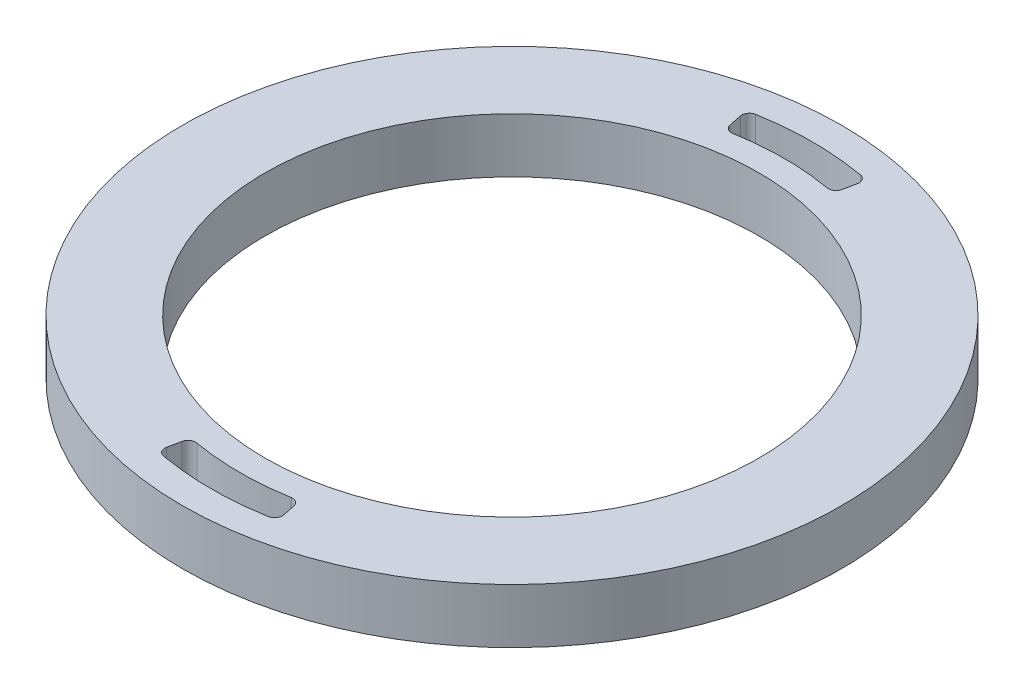
ISO-10303-21;
HEADER;
FILE_DESCRIPTION(('STEP AP214'),'2;1');
FILE_NAME('part.step','',(''),(''),'','','');
FILE_SCHEMA(('AUTOMOTIVE_DESIGN { 1 0 10303 214 1 1 1 1 }'));
ENDSEC;
DATA;
#1=APPLICATION_CONTEXT('core data for automotive mechanical design processes');
#2=APPLICATION_PROTOCOL_DEFINITION('international standard','automotive_design',2000,#1);
#3=PRODUCT_CONTEXT('',#1,'mechanical');
#4=PRODUCT('Part','Part','',(#3));
#5=PRODUCT_RELATED_PRODUCT_CATEGORY('part','',(#4));
#6=PRODUCT_DEFINITION_FORMATION('','',#4);
#7=PRODUCT_DEFINITION_CONTEXT('part definition',#1,'design');
#8=PRODUCT_DEFINITION('design','',#6,#7);
#9=PRODUCT_DEFINITION_SHAPE('','',#8);
#10=(LENGTH_UNIT() NAMED_UNIT(*) SI_UNIT(.MILLI.,.METRE.));
#11=(NAMED_UNIT(*) PLANE_ANGLE_UNIT() SI_UNIT($,.RADIAN.));
#12=(NAMED_UNIT(*) SI_UNIT($,.STERADIAN.) SOLID_ANGLE_UNIT());
#13=UNCERTAINTY_MEASURE_WITH_UNIT(LENGTH_MEASURE(1.E-05),#10,'distance_accuracy_value','');
#14=(GEOMETRIC_REPRESENTATION_CONTEXT(3) GLOBAL_UNCERTAINTY_ASSIGNED_CONTEXT((#13)) GLOBAL_UNIT_ASSIGNED_CONTEXT((#10,
#11,#12)) REPRESENTATION_CONTEXT('',''));
#15=CARTESIAN_POINT('',(0.,0.,0.));
#16=DIRECTION('',(0.,0.,1.));
#17=DIRECTION('',(1.,0.,0.));
#18=AXIS2_PLACEMENT_3D('',#15,#16,#17);
#19=CARTESIAN_POINT('',(0.,6.35,0.));
#20=DIRECTION('',(0.,1.,0.));
#21=DIRECTION('',(0.,0.,1.));
#22=AXIS2_PLACEMENT_3D('',#19,#20,#21);
#23=PLANE('',#22);
#24=DIRECTION('',(-0.2,0.,0.979795897113271));
#25=VECTOR('',#24,1.);
#26=CARTESIAN_POINT('',(0.,6.35,0.));
#27=LINE('',#26,#25);
#28=CARTESIAN_POINT('',(-6.49996868607842,6.35,31.8432132499219));
#29=VERTEX_POINT('',#28);
#30=CARTESIAN_POINT('',(-6.80487758890636,6.35,33.3369557098425));
#31=VERTEX_POINT('',#30);
#32=EDGE_CURVE('E163',#29,#31,#27,.T.);
#33=ORIENTED_EDGE('',*,*,#32,.F.);
#34=CARTESIAN_POINT('',(-5.62893013354472,6.35,32.0210132499219));
#35=DIRECTION('',(0.,1.,0.));
#36=DIRECTION('',(0.,0.,1.));
#37=AXIS2_PLACEMENT_3D('',#34,#35,#36);
#38=CIRCLE('',#37,0.889);
#39=CARTESIAN_POINT('',(-5.47501407520561,6.35,31.1454386688693));
#40=VERTEX_POINT('',#39);
#41=EDGE_CURVE('E158',#29,#40,#38,.F.);
#42=ORIENTED_EDGE('',*,*,#41,.T.);
#43=CARTESIAN_POINT('',(0.,6.35,0.));
#44=DIRECTION('',(0.,1.,0.));
#45=DIRECTION('',(0.,0.,1.));
#46=AXIS2_PLACEMENT_3D('',#43,#44,#45);
#47=CIRCLE('',#46,31.623);
#48=CARTESIAN_POINT('',(5.47501407520561,6.35,31.1454386688693));
#49=VERTEX_POINT('',#48);
#50=EDGE_CURVE('E161',#40,#49,#47,.T.);
#51=ORIENTED_EDGE('',*,*,#50,.T.);
#52=CARTESIAN_POINT('',(5.62893013354472,6.35,32.0210132499219));
#53=DIRECTION('',(0.,1.,0.));
#54=DIRECTION('',(0.,0.,1.));
#55=AXIS2_PLACEMENT_3D('',#52,#53,#54);
#56=CIRCLE('',#55,0.889);
#57=CARTESIAN_POINT('',(6.49996868607842,6.35,31.8432132499219));
#58=VERTEX_POINT('',#57);
#59=EDGE_CURVE('E244',#49,#58,#56,.F.);
#60=ORIENTED_EDGE('',*,*,#59,.T.);
#61=DIRECTION('',(0.2,0.,0.979795897113271));
#62=VECTOR('',#61,1.);
#63=CARTESIAN_POINT('',(0.,6.35,0.));
#64=LINE('',#63,#62);
#65=CARTESIAN_POINT('',(6.80487758890636,6.35,33.3369557098425));
#66=VERTEX_POINT('',#65);
#67=EDGE_CURVE('E182',#58,#66,#64,.T.);
#68=ORIENTED_EDGE('',*,*,#67,.T.);
#69=CARTESIAN_POINT('',(5.93383903637266,6.35,33.5147557098425));
#70=DIRECTION('',(0.,1.,0.));
#71=DIRECTION('',(0.,0.,1.));
#72=AXIS2_PLACEMENT_3D('',#69,#70,#71);
#73=CIRCLE('',#72,0.889);
#74=CARTESIAN_POINT('',(6.08882736941224,6.35,34.3901411201742));
#75=VERTEX_POINT('',#74);
#76=EDGE_CURVE('E257',#66,#75,#73,.F.);
#77=ORIENTED_EDGE('',*,*,#76,.T.);
#78=CARTESIAN_POINT('',(0.,6.35,0.));
#79=DIRECTION('',(0.,1.,0.));
#80=DIRECTION('',(0.,0.,1.));
#81=AXIS2_PLACEMENT_3D('',#78,#79,#80);
#82=CIRCLE('',#81,34.925);
#83=CARTESIAN_POINT('',(-6.08882736941224,6.35,34.3901411201742));
#84=VERTEX_POINT('',#83);
#85=EDGE_CURVE('E342',#84,#75,#82,.T.);
#86=ORIENTED_EDGE('',*,*,#85,.F.);
#87=CARTESIAN_POINT('',(-5.93383903637266,6.35,33.5147557098425));
#88=DIRECTION('',(0.,1.,0.));
#89=DIRECTION('',(0.,0.,1.));
#90=AXIS2_PLACEMENT_3D('',#87,#88,#89);
#91=CIRCLE('',#90,0.889);
#92=EDGE_CURVE('E251',#84,#31,#91,.F.);
#93=ORIENTED_EDGE('',*,*,#92,.T.);
#94=EDGE_LOOP('',(#33,#42,#51,#60,#68,#77,#86,#93));
#95=FACE_BOUND('',#94,.T.);
#96=CARTESIAN_POINT('',(0.,6.35,0.));
#97=DIRECTION('',(0.,1.,0.));
#98=DIRECTION('',(0.,0.,1.));
#99=AXIS2_PLACEMENT_3D('',#96,#97,#98);
#100=CIRCLE('',#99,38.2905);
#101=CARTESIAN_POINT('',(0.,6.35,38.2905));
#102=VERTEX_POINT('',#101);
#103=EDGE_CURVE('E187',#102,#102,#100,.T.);
#104=ORIENTED_EDGE('',*,*,#103,.T.);
#105=EDGE_LOOP('',(#104));
#106=FACE_BOUND('',#105,.T.);
#107=CARTESIAN_POINT('',(0.,6.35,0.));
#108=DIRECTION('',(0.,1.,0.));
#109=DIRECTION('',(0.,0.,1.));
#110=AXIS2_PLACEMENT_3D('',#107,#108,#109);
#111=CIRCLE('',#110,28.702);
#112=CARTESIAN_POINT('',(0.,6.35,28.702));
#113=VERTEX_POINT('',#112);
#114=EDGE_CURVE('E349',#113,#113,#111,.T.);
#115=ORIENTED_EDGE('',*,*,#114,.F.);
#116=EDGE_LOOP('',(#115));
#117=FACE_BOUND('',#116,.T.);
#118=DIRECTION('',(0.2,0.,-0.979795897113271));
#119=VECTOR('',#118,1.);
#120=CARTESIAN_POINT('',(0.,6.35,0.));
#121=LINE('',#120,#119);
#122=CARTESIAN_POINT('',(6.49996868607842,6.35,-31.8432132499219));
#123=VERTEX_POINT('',#122);
#124=CARTESIAN_POINT('',(6.80487758890636,6.35,-33.3369557098425));
#125=VERTEX_POINT('',#124);
#126=EDGE_CURVE('E319',#123,#125,#121,.T.);
#127=ORIENTED_EDGE('',*,*,#126,.F.);
#128=CARTESIAN_POINT('',(5.62893013354472,6.35,-32.0210132499219));
#129=DIRECTION('',(0.,1.,0.));
#130=DIRECTION('',(0.,0.,1.));
#131=AXIS2_PLACEMENT_3D('',#128,#129,#130);
#132=CIRCLE('',#131,0.889);
#133=CARTESIAN_POINT('',(5.47501407520561,6.35,-31.1454386688693));
#134=VERTEX_POINT('',#133);
#135=EDGE_CURVE('E263',#123,#134,#132,.F.);
#136=ORIENTED_EDGE('',*,*,#135,.T.);
#137=CARTESIAN_POINT('',(0.,6.35,0.));
#138=DIRECTION('',(0.,1.,0.));
#139=DIRECTION('',(0.,0.,1.));
#140=AXIS2_PLACEMENT_3D('',#137,#138,#139);
#141=CIRCLE('',#140,31.623);
#142=CARTESIAN_POINT('',(-5.47501407520561,6.35,-31.1454386688693));
#143=VERTEX_POINT('',#142);
#144=EDGE_CURVE('E286',#134,#143,#141,.T.);
#145=ORIENTED_EDGE('',*,*,#144,.T.);
#146=CARTESIAN_POINT('',(-5.62893013354472,6.35,-32.0210132499219));
#147=DIRECTION('',(0.,1.,0.));
#148=DIRECTION('',(0.,0.,1.));
#149=AXIS2_PLACEMENT_3D('',#146,#147,#148);
#150=CIRCLE('',#149,0.889);
#151=CARTESIAN_POINT('',(-6.49996868607842,6.35,-31.8432132499219));
#152=VERTEX_POINT('',#151);
#153=EDGE_CURVE('E52',#143,#152,#150,.F.);
#154=ORIENTED_EDGE('',*,*,#153,.T.);
#155=DIRECTION('',(-0.2,0.,-0.979795897113271));
#156=VECTOR('',#155,1.);
#157=CARTESIAN_POINT('',(0.,6.35,0.));
#158=LINE('',#157,#156);
#159=CARTESIAN_POINT('',(-6.80487758890636,6.35,-33.3369557098425));
#160=VERTEX_POINT('',#159);
#161=EDGE_CURVE('E284',#152,#160,#158,.T.);
#162=ORIENTED_EDGE('',*,*,#161,.T.);
#163=CARTESIAN_POINT('',(-5.93383903637266,6.35,-33.5147557098425));
#164=DIRECTION('',(0.,1.,0.));
#165=DIRECTION('',(0.,0.,1.));
#166=AXIS2_PLACEMENT_3D('',#163,#164,#165);
#167=CIRCLE('',#166,0.889);
#168=CARTESIAN_POINT('',(-6.08882736941225,6.35,-34.3901411201742));
#169=VERTEX_POINT('',#168);
#170=EDGE_CURVE('E275',#160,#169,#167,.F.);
#171=ORIENTED_EDGE('',*,*,#170,.T.);
#172=CARTESIAN_POINT('',(0.,6.35,0.));
#173=DIRECTION('',(0.,1.,0.));
#174=DIRECTION('',(0.,0.,1.));
#175=AXIS2_PLACEMENT_3D('',#172,#173,#174);
#176=CIRCLE('',#175,34.925);
#177=CARTESIAN_POINT('',(6.08882736941224,6.35,-34.3901411201742));
#178=VERTEX_POINT('',#177);
#179=EDGE_CURVE('E293',#178,#169,#176,.T.);
#180=ORIENTED_EDGE('',*,*,#179,.F.);
#181=CARTESIAN_POINT('',(5.93383903637266,6.35,-33.5147557098425));
#182=DIRECTION('',(0.,1.,0.));
#183=DIRECTION('',(0.,0.,1.));
#184=AXIS2_PLACEMENT_3D('',#181,#182,#183);
#185=CIRCLE('',#184,0.889);
#186=EDGE_CURVE('E269',#178,#125,#185,.F.);
#187=ORIENTED_EDGE('',*,*,#186,.T.);
#188=EDGE_LOOP('',(#127,#136,#145,#154,#162,#171,#180,#187));
#189=FACE_BOUND('',#188,.T.);
#190=ADVANCED_FACE('F43',(#95,#106,#117,#189),#23,.T.);
#191=CARTESIAN_POINT('',(0.,0.,0.));
#192=DIRECTION('',(0.,1.,0.));
#193=DIRECTION('',(0.,0.,1.));
#194=AXIS2_PLACEMENT_3D('',#191,#192,#193);
#195=PLANE('',#194);
#196=CARTESIAN_POINT('',(0.,0.,0.));
#197=DIRECTION('',(0.,1.,0.));
#198=DIRECTION('',(0.,0.,1.));
#199=AXIS2_PLACEMENT_3D('',#196,#197,#198);
#200=CIRCLE('',#199,28.702);
#201=CARTESIAN_POINT('',(0.,0.,28.702));
#202=VERTEX_POINT('',#201);
#203=EDGE_CURVE('E316',#202,#202,#200,.T.);
#204=ORIENTED_EDGE('',*,*,#203,.T.);
#205=EDGE_LOOP('',(#204));
#206=FACE_BOUND('',#205,.T.);
#207=CARTESIAN_POINT('',(0.,0.,0.));
#208=DIRECTION('',(0.,1.,0.));
#209=DIRECTION('',(0.,0.,1.));
#210=AXIS2_PLACEMENT_3D('',#207,#208,#209);
#211=CIRCLE('',#210,38.2905);
#212=CARTESIAN_POINT('',(0.,0.,38.2905));
#213=VERTEX_POINT('',#212);
#214=EDGE_CURVE('E194',#213,#213,#211,.T.);
#215=ORIENTED_EDGE('',*,*,#214,.F.);
#216=EDGE_LOOP('',(#215));
#217=FACE_BOUND('',#216,.T.);
#218=CARTESIAN_POINT('',(0.,0.,0.));
#219=DIRECTION('',(0.,1.,0.));
#220=DIRECTION('',(0.,0.,1.));
#221=AXIS2_PLACEMENT_3D('',#218,#219,#220);
#222=CIRCLE('',#221,31.623);
#223=CARTESIAN_POINT('',(-5.47501407520561,0.,31.1454386688693));
#224=VERTEX_POINT('',#223);
#225=CARTESIAN_POINT('',(5.47501407520561,0.,31.1454386688693));
#226=VERTEX_POINT('',#225);
#227=EDGE_CURVE('E320',#224,#226,#222,.T.);
#228=ORIENTED_EDGE('',*,*,#227,.F.);
#229=CARTESIAN_POINT('',(-5.62893013354472,0.,32.0210132499219));
#230=DIRECTION('',(0.,1.,0.));
#231=DIRECTION('',(0.,0.,1.));
#232=AXIS2_PLACEMENT_3D('',#229,#230,#231);
#233=CIRCLE('',#232,0.889);
#234=CARTESIAN_POINT('',(-6.49996868607842,0.,31.8432132499219));
#235=VERTEX_POINT('',#234);
#236=EDGE_CURVE('E169',#224,#235,#233,.T.);
#237=ORIENTED_EDGE('',*,*,#236,.T.);
#238=DIRECTION('',(-0.2,0.,0.979795897113271));
#239=VECTOR('',#238,1.);
#240=CARTESIAN_POINT('',(0.,0.,0.));
#241=LINE('',#240,#239);
#242=CARTESIAN_POINT('',(-6.80487758890636,0.,33.3369557098425));
#243=VERTEX_POINT('',#242);
#244=EDGE_CURVE('E181',#235,#243,#241,.T.);
#245=ORIENTED_EDGE('',*,*,#244,.T.);
#246=CARTESIAN_POINT('',(-5.93383903637266,0.,33.5147557098425));
#247=DIRECTION('',(0.,1.,0.));
#248=DIRECTION('',(0.,0.,1.));
#249=AXIS2_PLACEMENT_3D('',#246,#247,#248);
#250=CIRCLE('',#249,0.889);
#251=CARTESIAN_POINT('',(-6.08882736941224,0.,34.3901411201742));
#252=VERTEX_POINT('',#251);
#253=EDGE_CURVE('E254',#243,#252,#250,.T.);
#254=ORIENTED_EDGE('',*,*,#253,.T.);
#255=CARTESIAN_POINT('',(0.,0.,0.));
#256=DIRECTION('',(0.,1.,0.));
#257=DIRECTION('',(0.,0.,1.));
#258=AXIS2_PLACEMENT_3D('',#255,#256,#257);
#259=CIRCLE('',#258,34.925);
#260=CARTESIAN_POINT('',(6.08882736941224,0.,34.3901411201742));
#261=VERTEX_POINT('',#260);
#262=EDGE_CURVE('E330',#252,#261,#259,.T.);
#263=ORIENTED_EDGE('',*,*,#262,.T.);
#264=CARTESIAN_POINT('',(5.93383903637266,0.,33.5147557098425));
#265=DIRECTION('',(0.,1.,0.));
#266=DIRECTION('',(0.,0.,1.));
#267=AXIS2_PLACEMENT_3D('',#264,#265,#266);
#268=CIRCLE('',#267,0.889);
#269=CARTESIAN_POINT('',(6.80487758890636,0.,33.3369557098425));
#270=VERTEX_POINT('',#269);
#271=EDGE_CURVE('E260',#261,#270,#268,.T.);
#272=ORIENTED_EDGE('',*,*,#271,.T.);
#273=DIRECTION('',(0.2,0.,0.979795897113271));
#274=VECTOR('',#273,1.);
#275=CARTESIAN_POINT('',(0.,0.,0.));
#276=LINE('',#275,#274);
#277=CARTESIAN_POINT('',(6.49996868607842,0.,31.8432132499219));
#278=VERTEX_POINT('',#277);
#279=EDGE_CURVE('E334',#278,#270,#276,.T.);
#280=ORIENTED_EDGE('',*,*,#279,.F.);
#281=CARTESIAN_POINT('',(5.62893013354472,0.,32.0210132499219));
#282=DIRECTION('',(0.,1.,0.));
#283=DIRECTION('',(0.,0.,1.));
#284=AXIS2_PLACEMENT_3D('',#281,#282,#283);
#285=CIRCLE('',#284,0.889);
#286=EDGE_CURVE('E170',#278,#226,#285,.T.);
#287=ORIENTED_EDGE('',*,*,#286,.T.);
#288=EDGE_LOOP('',(#228,#237,#245,#254,#263,#272,#280,#287));
#289=FACE_BOUND('',#288,.T.);
#290=CARTESIAN_POINT('',(0.,0.,0.));
#291=DIRECTION('',(0.,1.,0.));
#292=DIRECTION('',(0.,0.,1.));
#293=AXIS2_PLACEMENT_3D('',#290,#291,#292);
#294=CIRCLE('',#293,31.623);
#295=CARTESIAN_POINT('',(5.47501407520561,0.,-31.1454386688693));
#296=VERTEX_POINT('',#295);
#297=CARTESIAN_POINT('',(-5.47501407520561,0.,-31.1454386688693));
#298=VERTEX_POINT('',#297);
#299=EDGE_CURVE('E292',#296,#298,#294,.T.);
#300=ORIENTED_EDGE('',*,*,#299,.F.);
#301=CARTESIAN_POINT('',(5.62893013354472,0.,-32.0210132499219));
#302=DIRECTION('',(0.,1.,0.));
#303=DIRECTION('',(0.,0.,1.));
#304=AXIS2_PLACEMENT_3D('',#301,#302,#303);
#305=CIRCLE('',#304,0.889);
#306=CARTESIAN_POINT('',(6.49996868607842,0.,-31.8432132499219));
#307=VERTEX_POINT('',#306);
#308=EDGE_CURVE('E266',#296,#307,#305,.T.);
#309=ORIENTED_EDGE('',*,*,#308,.T.);
#310=DIRECTION('',(0.2,0.,-0.979795897113271));
#311=VECTOR('',#310,1.);
#312=CARTESIAN_POINT('',(0.,0.,0.));
#313=LINE('',#312,#311);
#314=CARTESIAN_POINT('',(6.80487758890636,0.,-33.3369557098425));
#315=VERTEX_POINT('',#314);
#316=EDGE_CURVE('E305',#307,#315,#313,.T.);
#317=ORIENTED_EDGE('',*,*,#316,.T.);
#318=CARTESIAN_POINT('',(5.93383903637266,0.,-33.5147557098425));
#319=DIRECTION('',(0.,1.,0.));
#320=DIRECTION('',(0.,0.,1.));
#321=AXIS2_PLACEMENT_3D('',#318,#319,#320);
#322=CIRCLE('',#321,0.889);
#323=CARTESIAN_POINT('',(6.08882736941224,0.,-34.3901411201742));
#324=VERTEX_POINT('',#323);
#325=EDGE_CURVE('E272',#315,#324,#322,.T.);
#326=ORIENTED_EDGE('',*,*,#325,.T.);
#327=CARTESIAN_POINT('',(0.,0.,0.));
#328=DIRECTION('',(0.,1.,0.));
#329=DIRECTION('',(0.,0.,1.));
#330=AXIS2_PLACEMENT_3D('',#327,#328,#329);
#331=CIRCLE('',#330,34.925);
#332=CARTESIAN_POINT('',(-6.08882736941225,0.,-34.3901411201742));
#333=VERTEX_POINT('',#332);
#334=EDGE_CURVE('E309',#324,#333,#331,.T.);
#335=ORIENTED_EDGE('',*,*,#334,.T.);
#336=CARTESIAN_POINT('',(-5.93383903637266,0.,-33.5147557098425));
#337=DIRECTION('',(0.,1.,0.));
#338=DIRECTION('',(0.,0.,1.));
#339=AXIS2_PLACEMENT_3D('',#336,#337,#338);
#340=CIRCLE('',#339,0.889);
#341=CARTESIAN_POINT('',(-6.80487758890636,0.,-33.3369557098425));
#342=VERTEX_POINT('',#341);
#343=EDGE_CURVE('E59',#333,#342,#340,.T.);
#344=ORIENTED_EDGE('',*,*,#343,.T.);
#345=DIRECTION('',(-0.2,0.,-0.979795897113271));
#346=VECTOR('',#345,1.);
#347=CARTESIAN_POINT('',(0.,0.,0.));
#348=LINE('',#347,#346);
#349=CARTESIAN_POINT('',(-6.49996868607842,0.,-31.8432132499219));
#350=VERTEX_POINT('',#349);
#351=EDGE_CURVE('E300',#350,#342,#348,.T.);
#352=ORIENTED_EDGE('',*,*,#351,.F.);
#353=CARTESIAN_POINT('',(-5.62893013354472,0.,-32.0210132499219));
#354=DIRECTION('',(0.,1.,0.));
#355=DIRECTION('',(0.,0.,1.));
#356=AXIS2_PLACEMENT_3D('',#353,#354,#355);
#357=CIRCLE('',#356,0.889);
#358=EDGE_CURVE('E11',#350,#298,#357,.T.);
#359=ORIENTED_EDGE('',*,*,#358,.T.);
#360=EDGE_LOOP('',(#300,#309,#317,#326,#335,#344,#352,#359));
#361=FACE_BOUND('',#360,.T.);
#362=ADVANCED_FACE('F298',(#206,#217,#289,#361),#195,.F.);
#363=CARTESIAN_POINT('',(0.,6.35,0.));
#364=DIRECTION('',(0.,-1.,0.));
#365=DIRECTION('',(0.,0.,-1.));
#366=AXIS2_PLACEMENT_3D('',#363,#364,#365);
#367=CYLINDRICAL_SURFACE('',#366,38.2905);
#368=ORIENTED_EDGE('',*,*,#103,.F.);
#369=EDGE_LOOP('',(#368));
#370=FACE_BOUND('',#369,.T.);
#371=ORIENTED_EDGE('',*,*,#214,.T.);
#372=EDGE_LOOP('',(#371));
#373=FACE_BOUND('',#372,.T.);
#374=ADVANCED_FACE('F362',(#370,#373),#367,.T.);
#375=CARTESIAN_POINT('',(0.,6.35,0.));
#376=DIRECTION('',(0.,-1.,0.));
#377=DIRECTION('',(0.,0.,-1.));
#378=AXIS2_PLACEMENT_3D('',#375,#376,#377);
#379=CYLINDRICAL_SURFACE('',#378,28.702);
#380=ORIENTED_EDGE('',*,*,#114,.T.);
#381=EDGE_LOOP('',(#380));
#382=FACE_BOUND('',#381,.T.);
#383=ORIENTED_EDGE('',*,*,#203,.F.);
#384=EDGE_LOOP('',(#383));
#385=FACE_BOUND('',#384,.T.);
#386=ADVANCED_FACE('F359',(#382,#385),#379,.F.);
#387=CARTESIAN_POINT('',(0.,0.,0.));
#388=DIRECTION('',(-0.979795897113271,0.,-0.2));
#389=DIRECTION('',(-0.2,0.,0.979795897113271));
#390=AXIS2_PLACEMENT_3D('',#387,#388,#389);
#391=PLANE('',#390);
#392=ORIENTED_EDGE('',*,*,#244,.F.);
#393=DIRECTION('',(0.,1.,0.));
#394=VECTOR('',#393,1.);
#395=CARTESIAN_POINT('',(-6.49996868607842,0.,31.8432132499219));
#396=LINE('',#395,#394);
#397=EDGE_CURVE('E207',#235,#29,#396,.T.);
#398=ORIENTED_EDGE('',*,*,#397,.T.);
#399=ORIENTED_EDGE('',*,*,#32,.T.);
#400=DIRECTION('',(0.,-1.,0.));
#401=VECTOR('',#400,1.);
#402=CARTESIAN_POINT('',(-6.80487758890636,0.,33.3369557098425));
#403=LINE('',#402,#401);
#404=EDGE_CURVE('E204',#31,#243,#403,.T.);
#405=ORIENTED_EDGE('',*,*,#404,.T.);
#406=EDGE_LOOP('',(#392,#398,#399,#405));
#407=FACE_BOUND('',#406,.T.);
#408=ADVANCED_FACE('F361',(#407),#391,.F.);
#409=CARTESIAN_POINT('',(0.,0.,0.));
#410=DIRECTION('',(0.,1.,0.));
#411=DIRECTION('',(0.,0.,1.));
#412=AXIS2_PLACEMENT_3D('',#409,#410,#411);
#413=CYLINDRICAL_SURFACE('',#412,31.623);
#414=ORIENTED_EDGE('',*,*,#227,.T.);
#415=DIRECTION('',(0.,1.,0.));
#416=VECTOR('',#415,1.);
#417=CARTESIAN_POINT('',(5.47501407520561,0.,31.1454386688693));
#418=LINE('',#417,#416);
#419=EDGE_CURVE('E179',#226,#49,#418,.T.);
#420=ORIENTED_EDGE('',*,*,#419,.T.);
#421=ORIENTED_EDGE('',*,*,#50,.F.);
#422=DIRECTION('',(0.,1.,0.));
#423=VECTOR('',#422,1.);
#424=CARTESIAN_POINT('',(-5.47501407520561,0.,31.1454386688693));
#425=LINE('',#424,#423);
#426=EDGE_CURVE('E176',#40,#224,#425,.F.);
#427=ORIENTED_EDGE('',*,*,#426,.T.);
#428=EDGE_LOOP('',(#414,#420,#421,#427));
#429=FACE_BOUND('',#428,.T.);
#430=ADVANCED_FACE('F175',(#429),#413,.T.);
#431=CARTESIAN_POINT('',(0.,0.,0.));
#432=DIRECTION('',(-0.979795897113271,0.,0.2));
#433=DIRECTION('',(0.2,0.,0.979795897113271));
#434=AXIS2_PLACEMENT_3D('',#431,#432,#433);
#435=PLANE('',#434);
#436=ORIENTED_EDGE('',*,*,#67,.F.);
#437=DIRECTION('',(0.,-1.,0.));
#438=VECTOR('',#437,1.);
#439=CARTESIAN_POINT('',(6.49996868607842,0.,31.8432132499219));
#440=LINE('',#439,#438);
#441=EDGE_CURVE('E201',#58,#278,#440,.T.);
#442=ORIENTED_EDGE('',*,*,#441,.T.);
#443=ORIENTED_EDGE('',*,*,#279,.T.);
#444=DIRECTION('',(0.,1.,0.));
#445=VECTOR('',#444,1.);
#446=CARTESIAN_POINT('',(6.80487758890636,0.,33.3369557098425));
#447=LINE('',#446,#445);
#448=EDGE_CURVE('E191',#270,#66,#447,.T.);
#449=ORIENTED_EDGE('',*,*,#448,.T.);
#450=EDGE_LOOP('',(#436,#442,#443,#449));
#451=FACE_BOUND('',#450,.T.);
#452=ADVANCED_FACE('F432',(#451),#435,.T.);
#453=CARTESIAN_POINT('',(0.,0.,0.));
#454=DIRECTION('',(0.,1.,0.));
#455=DIRECTION('',(0.,0.,1.));
#456=AXIS2_PLACEMENT_3D('',#453,#454,#455);
#457=CYLINDRICAL_SURFACE('',#456,34.925);
#458=ORIENTED_EDGE('',*,*,#262,.F.);
#459=DIRECTION('',(0.,1.,0.));
#460=VECTOR('',#459,1.);
#461=CARTESIAN_POINT('',(-6.08882736941225,0.,34.3901411201742));
#462=LINE('',#461,#460);
#463=EDGE_CURVE('E213',#252,#84,#462,.T.);
#464=ORIENTED_EDGE('',*,*,#463,.T.);
#465=ORIENTED_EDGE('',*,*,#85,.T.);
#466=DIRECTION('',(0.,1.,0.));
#467=VECTOR('',#466,1.);
#468=CARTESIAN_POINT('',(6.08882736941225,0.,34.3901411201742));
#469=LINE('',#468,#467);
#470=EDGE_CURVE('E210',#75,#261,#469,.F.);
#471=ORIENTED_EDGE('',*,*,#470,.T.);
#472=EDGE_LOOP('',(#458,#464,#465,#471));
#473=FACE_BOUND('',#472,.T.);
#474=ADVANCED_FACE('F429',(#473),#457,.F.);
#475=CARTESIAN_POINT('',(0.,0.,0.));
#476=DIRECTION('',(0.,1.,0.));
#477=DIRECTION('',(0.,0.,1.));
#478=AXIS2_PLACEMENT_3D('',#475,#476,#477);
#479=CYLINDRICAL_SURFACE('',#478,31.623);
#480=ORIENTED_EDGE('',*,*,#144,.F.);
#481=DIRECTION('',(0.,1.,0.));
#482=VECTOR('',#481,1.);
#483=CARTESIAN_POINT('',(5.47501407520561,0.,-31.1454386688693));
#484=LINE('',#483,#482);
#485=EDGE_CURVE('E228',#134,#296,#484,.F.);
#486=ORIENTED_EDGE('',*,*,#485,.T.);
#487=ORIENTED_EDGE('',*,*,#299,.T.);
#488=DIRECTION('',(0.,1.,0.));
#489=VECTOR('',#488,1.);
#490=CARTESIAN_POINT('',(-5.47501407520561,0.,-31.1454386688693));
#491=LINE('',#490,#489);
#492=EDGE_CURVE('E224',#298,#143,#491,.T.);
#493=ORIENTED_EDGE('',*,*,#492,.T.);
#494=EDGE_LOOP('',(#480,#486,#487,#493));
#495=FACE_BOUND('',#494,.T.);
#496=ADVANCED_FACE('F302',(#495),#479,.T.);
#497=CARTESIAN_POINT('',(0.,0.,0.));
#498=DIRECTION('',(0.979795897113271,0.,-0.2));
#499=DIRECTION('',(-0.2,0.,-0.979795897113271));
#500=AXIS2_PLACEMENT_3D('',#497,#498,#499);
#501=PLANE('',#500);
#502=ORIENTED_EDGE('',*,*,#351,.T.);
#503=DIRECTION('',(0.,1.,0.));
#504=VECTOR('',#503,1.);
#505=CARTESIAN_POINT('',(-6.80487758890636,0.,-33.3369557098425));
#506=LINE('',#505,#504);
#507=EDGE_CURVE('E240',#342,#160,#506,.T.);
#508=ORIENTED_EDGE('',*,*,#507,.T.);
#509=ORIENTED_EDGE('',*,*,#161,.F.);
#510=DIRECTION('',(0.,-1.,0.));
#511=VECTOR('',#510,1.);
#512=CARTESIAN_POINT('',(-6.49996868607842,0.,-31.8432132499219));
#513=LINE('',#512,#511);
#514=EDGE_CURVE('E66',#152,#350,#513,.T.);
#515=ORIENTED_EDGE('',*,*,#514,.T.);
#516=EDGE_LOOP('',(#502,#508,#509,#515));
#517=FACE_BOUND('',#516,.T.);
#518=ADVANCED_FACE('F289',(#517),#501,.T.);
#519=CARTESIAN_POINT('',(0.,0.,0.));
#520=DIRECTION('',(0.,1.,0.));
#521=DIRECTION('',(0.,0.,1.));
#522=AXIS2_PLACEMENT_3D('',#519,#520,#521);
#523=CYLINDRICAL_SURFACE('',#522,34.925);
#524=ORIENTED_EDGE('',*,*,#334,.F.);
#525=DIRECTION('',(0.,1.,0.));
#526=VECTOR('',#525,1.);
#527=CARTESIAN_POINT('',(6.08882736941224,0.,-34.3901411201742));
#528=LINE('',#527,#526);
#529=EDGE_CURVE('E234',#324,#178,#528,.T.);
#530=ORIENTED_EDGE('',*,*,#529,.T.);
#531=ORIENTED_EDGE('',*,*,#179,.T.);
#532=DIRECTION('',(0.,1.,0.));
#533=VECTOR('',#532,1.);
#534=CARTESIAN_POINT('',(-6.08882736941225,0.,-34.3901411201742));
#535=LINE('',#534,#533);
#536=EDGE_CURVE('E231',#169,#333,#535,.F.);
#537=ORIENTED_EDGE('',*,*,#536,.T.);
#538=EDGE_LOOP('',(#524,#530,#531,#537));
#539=FACE_BOUND('',#538,.T.);
#540=ADVANCED_FACE('F412',(#539),#523,.F.);
#541=CARTESIAN_POINT('',(0.,0.,0.));
#542=DIRECTION('',(0.979795897113271,0.,0.2));
#543=DIRECTION('',(0.2,0.,-0.979795897113271));
#544=AXIS2_PLACEMENT_3D('',#541,#542,#543);
#545=PLANE('',#544);
#546=ORIENTED_EDGE('',*,*,#316,.F.);
#547=DIRECTION('',(0.,1.,0.));
#548=VECTOR('',#547,1.);
#549=CARTESIAN_POINT('',(6.49996868607842,0.,-31.8432132499219));
#550=LINE('',#549,#548);
#551=EDGE_CURVE('E220',#307,#123,#550,.T.);
#552=ORIENTED_EDGE('',*,*,#551,.T.);
#553=ORIENTED_EDGE('',*,*,#126,.T.);
#554=DIRECTION('',(0.,-1.,0.));
#555=VECTOR('',#554,1.);
#556=CARTESIAN_POINT('',(6.80487758890636,0.,-33.3369557098425));
#557=LINE('',#556,#555);
#558=EDGE_CURVE('E217',#125,#315,#557,.T.);
#559=ORIENTED_EDGE('',*,*,#558,.T.);
#560=EDGE_LOOP('',(#546,#552,#553,#559));
#561=FACE_BOUND('',#560,.T.);
#562=ADVANCED_FACE('F383',(#561),#545,.F.);
#563=CARTESIAN_POINT('',(5.62893013354472,0.,32.0210132499219));
#564=DIRECTION('',(0.,1.,0.));
#565=DIRECTION('',(0.,0.,1.));
#566=AXIS2_PLACEMENT_3D('',#563,#564,#565);
#567=CYLINDRICAL_SURFACE('',#566,0.889);
#568=ORIENTED_EDGE('',*,*,#286,.F.);
#569=ORIENTED_EDGE('',*,*,#441,.F.);
#570=ORIENTED_EDGE('',*,*,#59,.F.);
#571=ORIENTED_EDGE('',*,*,#419,.F.);
#572=EDGE_LOOP('',(#568,#569,#570,#571));
#573=FACE_BOUND('',#572,.T.);
#574=ADVANCED_FACE('F380',(#573),#567,.F.);
#575=CARTESIAN_POINT('',(-5.62893013354472,0.,32.0210132499219));
#576=DIRECTION('',(0.,1.,0.));
#577=DIRECTION('',(0.,0.,1.));
#578=AXIS2_PLACEMENT_3D('',#575,#576,#577);
#579=CYLINDRICAL_SURFACE('',#578,0.889);
#580=ORIENTED_EDGE('',*,*,#236,.F.);
#581=ORIENTED_EDGE('',*,*,#426,.F.);
#582=ORIENTED_EDGE('',*,*,#41,.F.);
#583=ORIENTED_EDGE('',*,*,#397,.F.);
#584=EDGE_LOOP('',(#580,#581,#582,#583));
#585=FACE_BOUND('',#584,.T.);
#586=ADVANCED_FACE('F185',(#585),#579,.F.);
#587=CARTESIAN_POINT('',(-5.93383903637266,0.,33.5147557098425));
#588=DIRECTION('',(0.,1.,0.));
#589=DIRECTION('',(0.,0.,1.));
#590=AXIS2_PLACEMENT_3D('',#587,#588,#589);
#591=CYLINDRICAL_SURFACE('',#590,0.889);
#592=ORIENTED_EDGE('',*,*,#253,.F.);
#593=ORIENTED_EDGE('',*,*,#404,.F.);
#594=ORIENTED_EDGE('',*,*,#92,.F.);
#595=ORIENTED_EDGE('',*,*,#463,.F.);
#596=EDGE_LOOP('',(#592,#593,#594,#595));
#597=FACE_BOUND('',#596,.T.);
#598=ADVANCED_FACE('F387',(#597),#591,.F.);
#599=CARTESIAN_POINT('',(5.93383903637266,0.,33.5147557098425));
#600=DIRECTION('',(0.,1.,0.));
#601=DIRECTION('',(0.,0.,1.));
#602=AXIS2_PLACEMENT_3D('',#599,#600,#601);
#603=CYLINDRICAL_SURFACE('',#602,0.889);
#604=ORIENTED_EDGE('',*,*,#271,.F.);
#605=ORIENTED_EDGE('',*,*,#470,.F.);
#606=ORIENTED_EDGE('',*,*,#76,.F.);
#607=ORIENTED_EDGE('',*,*,#448,.F.);
#608=EDGE_LOOP('',(#604,#605,#606,#607));
#609=FACE_BOUND('',#608,.T.);
#610=ADVANCED_FACE('F390',(#609),#603,.F.);
#611=CARTESIAN_POINT('',(5.62893013354472,0.,-32.0210132499219));
#612=DIRECTION('',(0.,1.,0.));
#613=DIRECTION('',(0.,0.,1.));
#614=AXIS2_PLACEMENT_3D('',#611,#612,#613);
#615=CYLINDRICAL_SURFACE('',#614,0.889);
#616=ORIENTED_EDGE('',*,*,#308,.F.);
#617=ORIENTED_EDGE('',*,*,#485,.F.);
#618=ORIENTED_EDGE('',*,*,#135,.F.);
#619=ORIENTED_EDGE('',*,*,#551,.F.);
#620=EDGE_LOOP('',(#616,#617,#618,#619));
#621=FACE_BOUND('',#620,.T.);
#622=ADVANCED_FACE('F394',(#621),#615,.F.);
#623=CARTESIAN_POINT('',(5.93383903637266,0.,-33.5147557098425));
#624=DIRECTION('',(0.,1.,0.));
#625=DIRECTION('',(0.,0.,1.));
#626=AXIS2_PLACEMENT_3D('',#623,#624,#625);
#627=CYLINDRICAL_SURFACE('',#626,0.889);
#628=ORIENTED_EDGE('',*,*,#325,.F.);
#629=ORIENTED_EDGE('',*,*,#558,.F.);
#630=ORIENTED_EDGE('',*,*,#186,.F.);
#631=ORIENTED_EDGE('',*,*,#529,.F.);
#632=EDGE_LOOP('',(#628,#629,#630,#631));
#633=FACE_BOUND('',#632,.T.);
#634=ADVANCED_FACE('F398',(#633),#627,.F.);
#635=CARTESIAN_POINT('',(-5.93383903637266,0.,-33.5147557098425));
#636=DIRECTION('',(0.,1.,0.));
#637=DIRECTION('',(0.,0.,1.));
#638=AXIS2_PLACEMENT_3D('',#635,#636,#637);
#639=CYLINDRICAL_SURFACE('',#638,0.889);
#640=ORIENTED_EDGE('',*,*,#343,.F.);
#641=ORIENTED_EDGE('',*,*,#536,.F.);
#642=ORIENTED_EDGE('',*,*,#170,.F.);
#643=ORIENTED_EDGE('',*,*,#507,.F.);
#644=EDGE_LOOP('',(#640,#641,#642,#643));
#645=FACE_BOUND('',#644,.T.);
#646=ADVANCED_FACE('F401',(#645),#639,.F.);
#647=CARTESIAN_POINT('',(-5.62893013354472,0.,-32.0210132499219));
#648=DIRECTION('',(0.,1.,0.));
#649=DIRECTION('',(0.,0.,1.));
#650=AXIS2_PLACEMENT_3D('',#647,#648,#649);
#651=CYLINDRICAL_SURFACE('',#650,0.889);
#652=ORIENTED_EDGE('',*,*,#358,.F.);
#653=ORIENTED_EDGE('',*,*,#514,.F.);
#654=ORIENTED_EDGE('',*,*,#153,.F.);
#655=ORIENTED_EDGE('',*,*,#492,.F.);
#656=EDGE_LOOP('',(#652,#653,#654,#655));
#657=FACE_BOUND('',#656,.T.);
#658=ADVANCED_FACE('F45',(#657),#651,.F.);
#659=CLOSED_SHELL('',(#190,#362,#374,#386,#408,#430,#452,#474,#496,#518,#540,#562,#574,#586,
#598,#610,#622,#634,#646,#658));
#660=MANIFOLD_SOLID_BREP('B2',#659);
#661=ADVANCED_BREP_SHAPE_REPRESENTATION('',(#18,#660),#14);
#662=SHAPE_DEFINITION_REPRESENTATION(#9,#661);
ENDSEC;
END-ISO-10303-21;
